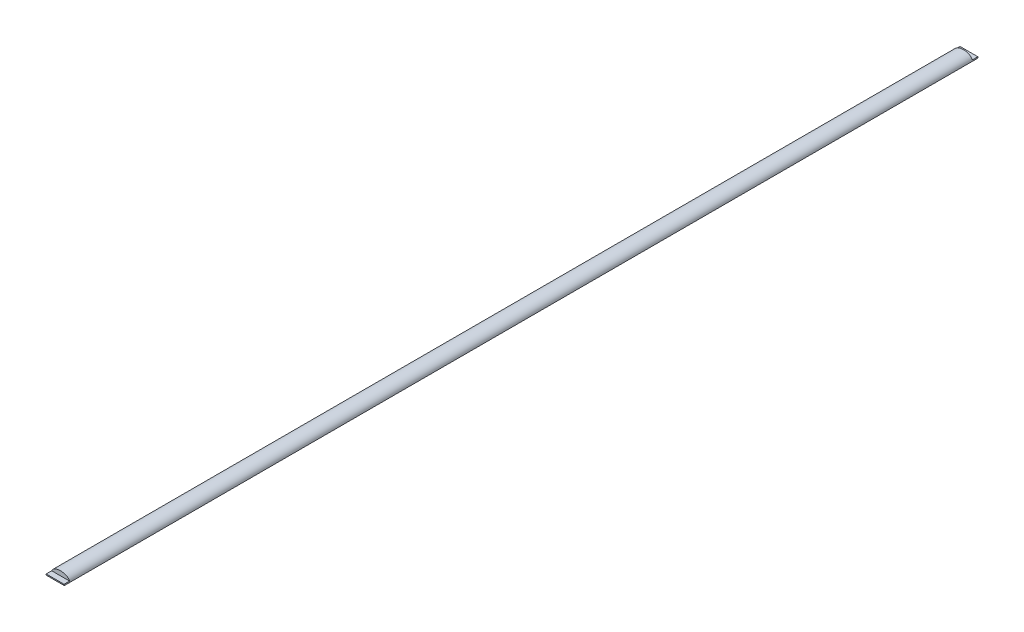
ISO-10303-21;
HEADER;
FILE_DESCRIPTION(('STEP AP214'),'2;1');
FILE_NAME('part.step','',(''),(''),'','','');
FILE_SCHEMA(('AUTOMOTIVE_DESIGN { 1 0 10303 214 1 1 1 1 }'));
ENDSEC;
DATA;
#1=APPLICATION_CONTEXT('core data for automotive mechanical design processes');
#2=APPLICATION_PROTOCOL_DEFINITION('international standard','automotive_design',2000,#1);
#3=PRODUCT_CONTEXT('',#1,'mechanical');
#4=PRODUCT('Part','Part','',(#3));
#5=PRODUCT_RELATED_PRODUCT_CATEGORY('part','',(#4));
#6=PRODUCT_DEFINITION_FORMATION('','',#4);
#7=PRODUCT_DEFINITION_CONTEXT('part definition',#1,'design');
#8=PRODUCT_DEFINITION('design','',#6,#7);
#9=PRODUCT_DEFINITION_SHAPE('','',#8);
#10=(LENGTH_UNIT() NAMED_UNIT(*) SI_UNIT(.MILLI.,.METRE.));
#11=(NAMED_UNIT(*) PLANE_ANGLE_UNIT() SI_UNIT($,.RADIAN.));
#12=(NAMED_UNIT(*) SI_UNIT($,.STERADIAN.) SOLID_ANGLE_UNIT());
#13=UNCERTAINTY_MEASURE_WITH_UNIT(LENGTH_MEASURE(1.E-05),#10,'distance_accuracy_value','');
#14=(GEOMETRIC_REPRESENTATION_CONTEXT(3) GLOBAL_UNCERTAINTY_ASSIGNED_CONTEXT((#13)) GLOBAL_UNIT_ASSIGNED_CONTEXT((#10,
#11,#12)) REPRESENTATION_CONTEXT('',''));
#15=CARTESIAN_POINT('',(0.,0.,0.));
#16=DIRECTION('',(0.,0.,1.));
#17=DIRECTION('',(1.,0.,0.));
#18=AXIS2_PLACEMENT_3D('',#15,#16,#17);
#19=CARTESIAN_POINT('',(0.,0.,250.));
#20=DIRECTION('',(0.,0.,1.));
#21=DIRECTION('',(-1.,0.,0.));
#22=AXIS2_PLACEMENT_3D('',#19,#20,#21);
#23=ELLIPSE('',#22,5.,3.);
#24=DIRECTION('',(0.,0.,-1.));
#25=VECTOR('',#24,1.);
#26=SURFACE_OF_LINEAR_EXTRUSION('',#23,#25);
#27=CARTESIAN_POINT('',(0.,0.,-250.));
#28=DIRECTION('',(0.,0.,1.));
#29=DIRECTION('',(-1.,0.,0.));
#30=AXIS2_PLACEMENT_3D('',#27,#28,#29);
#31=ELLIPSE('',#30,5.,3.);
#32=CARTESIAN_POINT('',(5.,0.,-250.));
#33=VERTEX_POINT('',#32);
#34=CARTESIAN_POINT('',(4.89897948556636,0.600000000000003,-250.));
#35=VERTEX_POINT('',#34);
#36=EDGE_CURVE('E121',#33,#35,#31,.T.);
#37=ORIENTED_EDGE('',*,*,#36,.T.);
#38=DIRECTION('',(0.,0.,-1.));
#39=VECTOR('',#38,1.);
#40=CARTESIAN_POINT('',(4.89897948556636,0.600000000000003,-247.));
#41=LINE('',#40,#39);
#42=CARTESIAN_POINT('',(4.89897948556636,0.600000000000003,-247.));
#43=VERTEX_POINT('',#42);
#44=EDGE_CURVE('E48',#43,#35,#41,.T.);
#45=ORIENTED_EDGE('',*,*,#44,.F.);
#46=CARTESIAN_POINT('',(0.,0.,-247.));
#47=DIRECTION('',(0.,0.,1.));
#48=DIRECTION('',(-1.,0.,0.));
#49=AXIS2_PLACEMENT_3D('',#46,#47,#48);
#50=ELLIPSE('',#49,5.,3.);
#51=CARTESIAN_POINT('',(-4.89897948556636,0.600000000000001,-247.));
#52=VERTEX_POINT('',#51);
#53=EDGE_CURVE('E93',#43,#52,#50,.T.);
#54=ORIENTED_EDGE('',*,*,#53,.T.);
#55=DIRECTION('',(0.,0.,-1.));
#56=VECTOR('',#55,1.);
#57=CARTESIAN_POINT('',(-4.89897948556636,0.600000000000001,-247.));
#58=LINE('',#57,#56);
#59=CARTESIAN_POINT('',(-4.89897948556636,0.600000000000001,-250.));
#60=VERTEX_POINT('',#59);
#61=EDGE_CURVE('E85',#52,#60,#58,.T.);
#62=ORIENTED_EDGE('',*,*,#61,.T.);
#63=CARTESIAN_POINT('',(-5.,0.,-250.));
#64=VERTEX_POINT('',#63);
#65=EDGE_CURVE('E112',#60,#64,#31,.T.);
#66=ORIENTED_EDGE('',*,*,#65,.T.);
#67=DIRECTION('',(0.,0.,-1.));
#68=VECTOR('',#67,1.);
#69=CARTESIAN_POINT('',(-5.,0.,250.));
#70=LINE('',#69,#68);
#71=CARTESIAN_POINT('',(-5.,0.,250.));
#72=VERTEX_POINT('',#71);
#73=EDGE_CURVE('E11',#72,#64,#70,.T.);
#74=ORIENTED_EDGE('',*,*,#73,.F.);
#75=CARTESIAN_POINT('',(-4.89897948556636,0.600000000000001,250.));
#76=VERTEX_POINT('',#75);
#77=EDGE_CURVE('E119',#76,#72,#23,.T.);
#78=ORIENTED_EDGE('',*,*,#77,.F.);
#79=DIRECTION('',(0.,0.,1.));
#80=VECTOR('',#79,1.);
#81=CARTESIAN_POINT('',(-4.89897948556636,0.600000000000001,247.));
#82=LINE('',#81,#80);
#83=CARTESIAN_POINT('',(-4.89897948556636,0.600000000000001,247.));
#84=VERTEX_POINT('',#83);
#85=EDGE_CURVE('E56',#84,#76,#82,.T.);
#86=ORIENTED_EDGE('',*,*,#85,.F.);
#87=CARTESIAN_POINT('',(0.,0.,247.));
#88=DIRECTION('',(0.,0.,1.));
#89=DIRECTION('',(-1.,0.,0.));
#90=AXIS2_PLACEMENT_3D('',#87,#88,#89);
#91=ELLIPSE('',#90,5.,3.);
#92=CARTESIAN_POINT('',(4.89897948556636,0.600000000000003,247.));
#93=VERTEX_POINT('',#92);
#94=EDGE_CURVE('E106',#93,#84,#91,.T.);
#95=ORIENTED_EDGE('',*,*,#94,.F.);
#96=DIRECTION('',(0.,0.,1.));
#97=VECTOR('',#96,1.);
#98=CARTESIAN_POINT('',(4.89897948556636,0.600000000000003,247.));
#99=LINE('',#98,#97);
#100=CARTESIAN_POINT('',(4.89897948556636,0.600000000000003,250.));
#101=VERTEX_POINT('',#100);
#102=EDGE_CURVE('E109',#93,#101,#99,.T.);
#103=ORIENTED_EDGE('',*,*,#102,.T.);
#104=CARTESIAN_POINT('',(5.,0.,250.));
#105=VERTEX_POINT('',#104);
#106=EDGE_CURVE('E114',#105,#101,#23,.T.);
#107=ORIENTED_EDGE('',*,*,#106,.F.);
#108=DIRECTION('',(0.,0.,-1.));
#109=VECTOR('',#108,1.);
#110=CARTESIAN_POINT('',(5.,0.,250.));
#111=LINE('',#110,#109);
#112=EDGE_CURVE('E41',#105,#33,#111,.T.);
#113=ORIENTED_EDGE('',*,*,#112,.T.);
#114=EDGE_LOOP('',(#37,#45,#54,#62,#66,#74,#78,#86,#95,#103,#107,#113));
#115=FACE_BOUND('',#114,.T.);
#116=ADVANCED_FACE('F33',(#115),#26,.F.);
#117=CARTESIAN_POINT('',(0.,0.,250.));
#118=DIRECTION('',(0.,0.,1.));
#119=DIRECTION('',(1.,0.,0.));
#120=AXIS2_PLACEMENT_3D('',#117,#118,#119);
#121=PLANE('',#120);
#122=ORIENTED_EDGE('',*,*,#106,.T.);
#123=DIRECTION('',(-1.,0.,0.));
#124=VECTOR('',#123,1.);
#125=CARTESIAN_POINT('',(0.,0.600000000000002,250.));
#126=LINE('',#125,#124);
#127=EDGE_CURVE('E102',#101,#76,#126,.T.);
#128=ORIENTED_EDGE('',*,*,#127,.T.);
#129=ORIENTED_EDGE('',*,*,#77,.T.);
#130=DIRECTION('',(1.,0.,0.));
#131=VECTOR('',#130,1.);
#132=CARTESIAN_POINT('',(-5.,0.,250.));
#133=LINE('',#132,#131);
#134=EDGE_CURVE('E118',#72,#105,#133,.T.);
#135=ORIENTED_EDGE('',*,*,#134,.T.);
#136=EDGE_LOOP('',(#122,#128,#129,#135));
#137=FACE_BOUND('',#136,.T.);
#138=ADVANCED_FACE('F137',(#137),#121,.T.);
#139=CARTESIAN_POINT('',(-5.,0.,250.));
#140=DIRECTION('',(0.,1.,0.));
#141=DIRECTION('',(0.,0.,1.));
#142=AXIS2_PLACEMENT_3D('',#139,#140,#141);
#143=PLANE('',#142);
#144=DIRECTION('',(1.,0.,0.));
#145=VECTOR('',#144,1.);
#146=CARTESIAN_POINT('',(-5.,0.,-250.));
#147=LINE('',#146,#145);
#148=EDGE_CURVE('E123',#64,#33,#147,.T.);
#149=ORIENTED_EDGE('',*,*,#148,.T.);
#150=ORIENTED_EDGE('',*,*,#112,.F.);
#151=ORIENTED_EDGE('',*,*,#134,.F.);
#152=ORIENTED_EDGE('',*,*,#73,.T.);
#153=EDGE_LOOP('',(#149,#150,#151,#152));
#154=FACE_BOUND('',#153,.T.);
#155=ADVANCED_FACE('F135',(#154),#143,.F.);
#156=CARTESIAN_POINT('',(0.,0.,-250.));
#157=DIRECTION('',(0.,0.,1.));
#158=DIRECTION('',(1.,0.,0.));
#159=AXIS2_PLACEMENT_3D('',#156,#157,#158);
#160=PLANE('',#159);
#161=ORIENTED_EDGE('',*,*,#65,.F.);
#162=DIRECTION('',(-1.,0.,0.));
#163=VECTOR('',#162,1.);
#164=CARTESIAN_POINT('',(0.,0.600000000000002,-250.));
#165=LINE('',#164,#163);
#166=EDGE_CURVE('E89',#35,#60,#165,.T.);
#167=ORIENTED_EDGE('',*,*,#166,.F.);
#168=ORIENTED_EDGE('',*,*,#36,.F.);
#169=ORIENTED_EDGE('',*,*,#148,.F.);
#170=EDGE_LOOP('',(#161,#167,#168,#169));
#171=FACE_BOUND('',#170,.T.);
#172=ADVANCED_FACE('F132',(#171),#160,.F.);
#173=CARTESIAN_POINT('',(0.,0.600000000000002,247.));
#174=DIRECTION('',(0.,1.,0.));
#175=DIRECTION('',(-1.,0.,0.));
#176=AXIS2_PLACEMENT_3D('',#173,#174,#175);
#177=PLANE('',#176);
#178=ORIENTED_EDGE('',*,*,#127,.F.);
#179=ORIENTED_EDGE('',*,*,#102,.F.);
#180=DIRECTION('',(-1.,0.,0.));
#181=VECTOR('',#180,1.);
#182=CARTESIAN_POINT('',(0.,0.600000000000002,247.));
#183=LINE('',#182,#181);
#184=EDGE_CURVE('E104',#93,#84,#183,.T.);
#185=ORIENTED_EDGE('',*,*,#184,.T.);
#186=ORIENTED_EDGE('',*,*,#85,.T.);
#187=EDGE_LOOP('',(#178,#179,#185,#186));
#188=FACE_BOUND('',#187,.T.);
#189=ADVANCED_FACE('F138',(#188),#177,.T.);
#190=CARTESIAN_POINT('',(0.,0.,247.));
#191=DIRECTION('',(0.,0.,1.));
#192=DIRECTION('',(1.,0.,0.));
#193=AXIS2_PLACEMENT_3D('',#190,#191,#192);
#194=PLANE('',#193);
#195=ORIENTED_EDGE('',*,*,#184,.F.);
#196=ORIENTED_EDGE('',*,*,#94,.T.);
#197=EDGE_LOOP('',(#195,#196));
#198=FACE_BOUND('',#197,.T.);
#199=ADVANCED_FACE('F142',(#198),#194,.T.);
#200=CARTESIAN_POINT('',(0.,0.600000000000002,-247.));
#201=DIRECTION('',(0.,-1.,0.));
#202=DIRECTION('',(1.,0.,0.));
#203=AXIS2_PLACEMENT_3D('',#200,#201,#202);
#204=PLANE('',#203);
#205=ORIENTED_EDGE('',*,*,#166,.T.);
#206=ORIENTED_EDGE('',*,*,#61,.F.);
#207=DIRECTION('',(-1.,0.,0.));
#208=VECTOR('',#207,1.);
#209=CARTESIAN_POINT('',(0.,0.600000000000002,-247.));
#210=LINE('',#209,#208);
#211=EDGE_CURVE('E88',#43,#52,#210,.T.);
#212=ORIENTED_EDGE('',*,*,#211,.F.);
#213=ORIENTED_EDGE('',*,*,#44,.T.);
#214=EDGE_LOOP('',(#205,#206,#212,#213));
#215=FACE_BOUND('',#214,.T.);
#216=ADVANCED_FACE('F87',(#215),#204,.F.);
#217=CARTESIAN_POINT('',(0.,0.,-247.));
#218=DIRECTION('',(0.,0.,-1.));
#219=DIRECTION('',(1.,0.,0.));
#220=AXIS2_PLACEMENT_3D('',#217,#218,#219);
#221=PLANE('',#220);
#222=ORIENTED_EDGE('',*,*,#211,.T.);
#223=ORIENTED_EDGE('',*,*,#53,.F.);
#224=EDGE_LOOP('',(#222,#223));
#225=FACE_BOUND('',#224,.T.);
#226=ADVANCED_FACE('F96',(#225),#221,.T.);
#227=CLOSED_SHELL('',(#116,#138,#155,#172,#189,#199,#216,#226));
#228=MANIFOLD_SOLID_BREP('B2',#227);
#229=ADVANCED_BREP_SHAPE_REPRESENTATION('',(#18,#228),#14);
#230=SHAPE_DEFINITION_REPRESENTATION(#9,#229);
ENDSEC;
END-ISO-10303-21;
